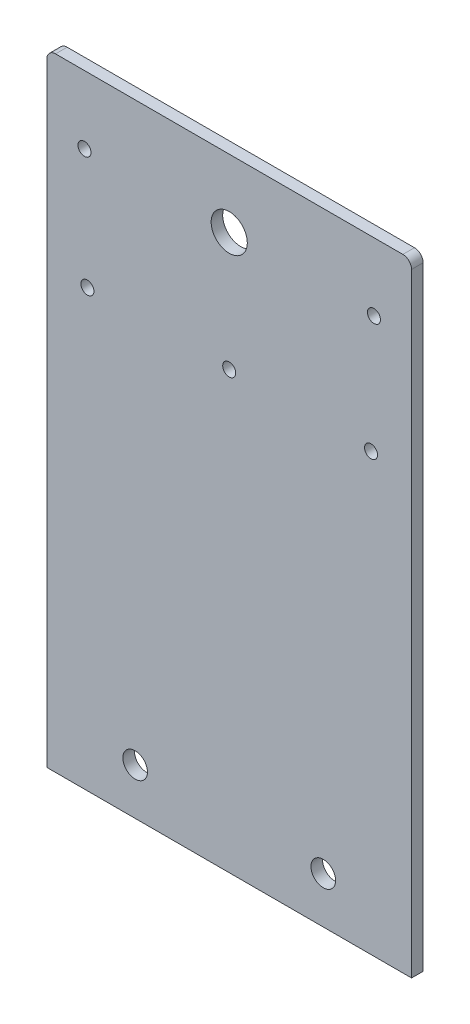
ISO-10303-21;
HEADER;
FILE_DESCRIPTION(('STEP AP214'),'2;1');
FILE_NAME('part.step','',(''),(''),'','','');
FILE_SCHEMA(('AUTOMOTIVE_DESIGN { 1 0 10303 214 1 1 1 1 }'));
ENDSEC;
DATA;
#1=APPLICATION_CONTEXT('core data for automotive mechanical design processes');
#2=APPLICATION_PROTOCOL_DEFINITION('international standard','automotive_design',2000,#1);
#3=PRODUCT_CONTEXT('',#1,'mechanical');
#4=PRODUCT('Part','Part','',(#3));
#5=PRODUCT_RELATED_PRODUCT_CATEGORY('part','',(#4));
#6=PRODUCT_DEFINITION_FORMATION('','',#4);
#7=PRODUCT_DEFINITION_CONTEXT('part definition',#1,'design');
#8=PRODUCT_DEFINITION('design','',#6,#7);
#9=PRODUCT_DEFINITION_SHAPE('','',#8);
#10=(LENGTH_UNIT() NAMED_UNIT(*) SI_UNIT(.MILLI.,.METRE.));
#11=(NAMED_UNIT(*) PLANE_ANGLE_UNIT() SI_UNIT($,.RADIAN.));
#12=(NAMED_UNIT(*) SI_UNIT($,.STERADIAN.) SOLID_ANGLE_UNIT());
#13=UNCERTAINTY_MEASURE_WITH_UNIT(LENGTH_MEASURE(1.E-05),#10,'distance_accuracy_value','');
#14=(GEOMETRIC_REPRESENTATION_CONTEXT(3) GLOBAL_UNCERTAINTY_ASSIGNED_CONTEXT((#13)) GLOBAL_UNIT_ASSIGNED_CONTEXT((#10,
#11,#12)) REPRESENTATION_CONTEXT('',''));
#15=CARTESIAN_POINT('',(0.,0.,0.));
#16=DIRECTION('',(0.,0.,1.));
#17=DIRECTION('',(1.,0.,0.));
#18=AXIS2_PLACEMENT_3D('',#15,#16,#17);
#19=CARTESIAN_POINT('',(2223.22133361921,1914.50039193908,-4.));
#20=DIRECTION('',(-1.,0.,0.));
#21=DIRECTION('',(0.,0.,1.));
#22=AXIS2_PLACEMENT_3D('',#19,#20,#21);
#23=PLANE('',#22);
#24=DIRECTION('',(0.,-1.,0.));
#25=VECTOR('',#24,1.);
#26=CARTESIAN_POINT('',(2223.22133361921,1914.50039193908,0.));
#27=LINE('',#26,#25);
#28=CARTESIAN_POINT('',(2223.22133361921,1911.50039193908,0.));
#29=VERTEX_POINT('',#28);
#30=CARTESIAN_POINT('',(2223.22133361921,1699.50039193908,0.));
#31=VERTEX_POINT('',#30);
#32=EDGE_CURVE('E117',#29,#31,#27,.T.);
#33=ORIENTED_EDGE('',*,*,#32,.F.);
#34=DIRECTION('',(0.,0.,1.));
#35=VECTOR('',#34,1.);
#36=CARTESIAN_POINT('',(2223.22133361921,1911.50039193908,-4.));
#37=LINE('',#36,#35);
#38=CARTESIAN_POINT('',(2223.22133361921,1911.50039193908,-4.));
#39=VERTEX_POINT('',#38);
#40=EDGE_CURVE('E11',#29,#39,#37,.F.);
#41=ORIENTED_EDGE('',*,*,#40,.T.);
#42=DIRECTION('',(0.,-1.,0.));
#43=VECTOR('',#42,1.);
#44=CARTESIAN_POINT('',(2223.22133361921,1914.50039193908,-4.));
#45=LINE('',#44,#43);
#46=CARTESIAN_POINT('',(2223.22133361921,1699.50039193908,-4.));
#47=VERTEX_POINT('',#46);
#48=EDGE_CURVE('E92',#39,#47,#45,.T.);
#49=ORIENTED_EDGE('',*,*,#48,.T.);
#50=DIRECTION('',(0.,0.,1.));
#51=VECTOR('',#50,1.);
#52=CARTESIAN_POINT('',(2223.22133361921,1699.50039193908,-4.));
#53=LINE('',#52,#51);
#54=EDGE_CURVE('E94',#47,#31,#53,.T.);
#55=ORIENTED_EDGE('',*,*,#54,.T.);
#56=EDGE_LOOP('',(#33,#41,#49,#55));
#57=FACE_BOUND('',#56,.T.);
#58=ADVANCED_FACE('F41',(#57),#23,.T.);
#59=CARTESIAN_POINT('',(2349.22133361921,1914.50039193908,-4.));
#60=DIRECTION('',(0.,1.,0.));
#61=DIRECTION('',(0.,0.,1.));
#62=AXIS2_PLACEMENT_3D('',#59,#60,#61);
#63=PLANE('',#62);
#64=DIRECTION('',(-1.,0.,0.));
#65=VECTOR('',#64,1.);
#66=CARTESIAN_POINT('',(2349.22133361921,1914.50039193908,0.));
#67=LINE('',#66,#65);
#68=CARTESIAN_POINT('',(2346.22133361921,1914.50039193908,0.));
#69=VERTEX_POINT('',#68);
#70=CARTESIAN_POINT('',(2226.22133361921,1914.50039193908,0.));
#71=VERTEX_POINT('',#70);
#72=EDGE_CURVE('E98',#69,#71,#67,.T.);
#73=ORIENTED_EDGE('',*,*,#72,.F.);
#74=DIRECTION('',(0.,0.,1.));
#75=VECTOR('',#74,1.);
#76=CARTESIAN_POINT('',(2346.22133361921,1914.50039193908,-4.));
#77=LINE('',#76,#75);
#78=CARTESIAN_POINT('',(2346.22133361921,1914.50039193908,-4.));
#79=VERTEX_POINT('',#78);
#80=EDGE_CURVE('E137',#69,#79,#77,.F.);
#81=ORIENTED_EDGE('',*,*,#80,.T.);
#82=DIRECTION('',(-1.,0.,0.));
#83=VECTOR('',#82,1.);
#84=CARTESIAN_POINT('',(2349.22133361921,1914.50039193908,-4.));
#85=LINE('',#84,#83);
#86=CARTESIAN_POINT('',(2226.22133361921,1914.50039193908,-4.));
#87=VERTEX_POINT('',#86);
#88=EDGE_CURVE('E106',#79,#87,#85,.T.);
#89=ORIENTED_EDGE('',*,*,#88,.T.);
#90=DIRECTION('',(0.,0.,1.));
#91=VECTOR('',#90,1.);
#92=CARTESIAN_POINT('',(2226.22133361921,1914.50039193908,-4.));
#93=LINE('',#92,#91);
#94=EDGE_CURVE('E134',#87,#71,#93,.T.);
#95=ORIENTED_EDGE('',*,*,#94,.T.);
#96=EDGE_LOOP('',(#73,#81,#89,#95));
#97=FACE_BOUND('',#96,.T.);
#98=ADVANCED_FACE('F151',(#97),#63,.T.);
#99=CARTESIAN_POINT('',(2349.22133361921,1699.50039193908,-4.));
#100=DIRECTION('',(1.,0.,0.));
#101=DIRECTION('',(0.,0.,-1.));
#102=AXIS2_PLACEMENT_3D('',#99,#100,#101);
#103=PLANE('',#102);
#104=DIRECTION('',(0.,1.,0.));
#105=VECTOR('',#104,1.);
#106=CARTESIAN_POINT('',(2349.22133361921,1699.50039193908,-4.));
#107=LINE('',#106,#105);
#108=CARTESIAN_POINT('',(2349.22133361921,1699.50039193908,-4.));
#109=VERTEX_POINT('',#108);
#110=CARTESIAN_POINT('',(2349.22133361921,1911.50039193908,-4.));
#111=VERTEX_POINT('',#110);
#112=EDGE_CURVE('E111',#109,#111,#107,.T.);
#113=ORIENTED_EDGE('',*,*,#112,.T.);
#114=DIRECTION('',(0.,0.,1.));
#115=VECTOR('',#114,1.);
#116=CARTESIAN_POINT('',(2349.22133361921,1911.50039193908,-4.));
#117=LINE('',#116,#115);
#118=CARTESIAN_POINT('',(2349.22133361921,1911.50039193908,0.));
#119=VERTEX_POINT('',#118);
#120=EDGE_CURVE('E126',#111,#119,#117,.T.);
#121=ORIENTED_EDGE('',*,*,#120,.T.);
#122=DIRECTION('',(0.,1.,0.));
#123=VECTOR('',#122,1.);
#124=CARTESIAN_POINT('',(2349.22133361921,1699.50039193908,0.));
#125=LINE('',#124,#123);
#126=CARTESIAN_POINT('',(2349.22133361921,1699.50039193908,0.));
#127=VERTEX_POINT('',#126);
#128=EDGE_CURVE('E121',#127,#119,#125,.T.);
#129=ORIENTED_EDGE('',*,*,#128,.F.);
#130=DIRECTION('',(0.,0.,1.));
#131=VECTOR('',#130,1.);
#132=CARTESIAN_POINT('',(2349.22133361921,1699.50039193908,-4.));
#133=LINE('',#132,#131);
#134=EDGE_CURVE('E105',#109,#127,#133,.T.);
#135=ORIENTED_EDGE('',*,*,#134,.F.);
#136=EDGE_LOOP('',(#113,#121,#129,#135));
#137=FACE_BOUND('',#136,.T.);
#138=ADVANCED_FACE('F144',(#137),#103,.T.);
#139=CARTESIAN_POINT('',(2223.22133361921,1699.50039193908,-4.));
#140=DIRECTION('',(0.,-1.,0.));
#141=DIRECTION('',(0.,0.,-1.));
#142=AXIS2_PLACEMENT_3D('',#139,#140,#141);
#143=PLANE('',#142);
#144=DIRECTION('',(1.,0.,0.));
#145=VECTOR('',#144,1.);
#146=CARTESIAN_POINT('',(2223.22133361921,1699.50039193908,0.));
#147=LINE('',#146,#145);
#148=EDGE_CURVE('E104',#31,#127,#147,.T.);
#149=ORIENTED_EDGE('',*,*,#148,.F.);
#150=ORIENTED_EDGE('',*,*,#54,.F.);
#151=DIRECTION('',(1.,0.,0.));
#152=VECTOR('',#151,1.);
#153=CARTESIAN_POINT('',(2223.22133361921,1699.50039193908,-4.));
#154=LINE('',#153,#152);
#155=EDGE_CURVE('E97',#47,#109,#154,.T.);
#156=ORIENTED_EDGE('',*,*,#155,.T.);
#157=ORIENTED_EDGE('',*,*,#134,.T.);
#158=EDGE_LOOP('',(#149,#150,#156,#157));
#159=FACE_BOUND('',#158,.T.);
#160=ADVANCED_FACE('F102',(#159),#143,.T.);
#161=CARTESIAN_POINT('',(0.,0.,-4.));
#162=DIRECTION('',(0.,0.,1.));
#163=DIRECTION('',(1.,0.,0.));
#164=AXIS2_PLACEMENT_3D('',#161,#162,#163);
#165=PLANE('',#164);
#166=CARTESIAN_POINT('',(2253.72133361921,1715.50039193908,-4.));
#167=DIRECTION('',(0.,0.,1.));
#168=DIRECTION('',(1.,0.,0.));
#169=AXIS2_PLACEMENT_3D('',#166,#167,#168);
#170=CIRCLE('',#169,4.24999999999981);
#171=CARTESIAN_POINT('',(2257.97133361921,1715.50039193908,-4.));
#172=VERTEX_POINT('',#171);
#173=EDGE_CURVE('E214',#172,#172,#170,.T.);
#174=ORIENTED_EDGE('',*,*,#173,.T.);
#175=EDGE_LOOP('',(#174));
#176=FACE_BOUND('',#175,.T.);
#177=CARTESIAN_POINT('',(2318.72133361921,1715.50039193908,-4.));
#178=DIRECTION('',(0.,0.,1.));
#179=DIRECTION('',(1.,0.,0.));
#180=AXIS2_PLACEMENT_3D('',#177,#178,#179);
#181=CIRCLE('',#180,4.24999999999981);
#182=CARTESIAN_POINT('',(2322.97133361921,1715.50039193908,-4.));
#183=VERTEX_POINT('',#182);
#184=EDGE_CURVE('E216',#183,#183,#181,.T.);
#185=ORIENTED_EDGE('',*,*,#184,.T.);
#186=EDGE_LOOP('',(#185));
#187=FACE_BOUND('',#186,.T.);
#188=CARTESIAN_POINT('',(2335.22132399011,1850.07710104147,-4.));
#189=DIRECTION('',(0.,0.,1.));
#190=DIRECTION('',(1.,0.,0.));
#191=AXIS2_PLACEMENT_3D('',#188,#189,#190);
#192=CIRCLE('',#191,2.25000000000009);
#193=CARTESIAN_POINT('',(2337.47132399011,1850.07710104147,-4.));
#194=VERTEX_POINT('',#193);
#195=EDGE_CURVE('E219',#194,#194,#192,.T.);
#196=ORIENTED_EDGE('',*,*,#195,.T.);
#197=EDGE_LOOP('',(#196));
#198=FACE_BOUND('',#197,.T.);
#199=CARTESIAN_POINT('',(2286.22133360148,1850.07709192478,-4.));
#200=DIRECTION('',(0.,0.,1.));
#201=DIRECTION('',(1.,0.,0.));
#202=AXIS2_PLACEMENT_3D('',#199,#200,#201);
#203=CIRCLE('',#202,2.25000000000009);
#204=CARTESIAN_POINT('',(2288.47133360148,1850.07709192478,-4.));
#205=VERTEX_POINT('',#204);
#206=EDGE_CURVE('E228',#205,#205,#203,.T.);
#207=ORIENTED_EDGE('',*,*,#206,.T.);
#208=EDGE_LOOP('',(#207));
#209=FACE_BOUND('',#208,.T.);
#210=CARTESIAN_POINT('',(2237.22133361921,1850.07709193908,-4.));
#211=DIRECTION('',(0.,0.,1.));
#212=DIRECTION('',(1.,0.,0.));
#213=AXIS2_PLACEMENT_3D('',#210,#211,#212);
#214=CIRCLE('',#213,2.25000000000009);
#215=CARTESIAN_POINT('',(2239.47133361921,1850.07709193908,-4.));
#216=VERTEX_POINT('',#215);
#217=EDGE_CURVE('E234',#216,#216,#214,.T.);
#218=ORIENTED_EDGE('',*,*,#217,.T.);
#219=EDGE_LOOP('',(#218));
#220=FACE_BOUND('',#219,.T.);
#221=CARTESIAN_POINT('',(2336.22131775677,1891.0768015385,-4.));
#222=DIRECTION('',(0.,0.,1.));
#223=DIRECTION('',(1.,0.,0.));
#224=AXIS2_PLACEMENT_3D('',#221,#222,#223);
#225=CIRCLE('',#224,2.25000000000009);
#226=CARTESIAN_POINT('',(2338.47131775677,1891.0768015385,-4.));
#227=VERTEX_POINT('',#226);
#228=EDGE_CURVE('E240',#227,#227,#225,.T.);
#229=ORIENTED_EDGE('',*,*,#228,.T.);
#230=EDGE_LOOP('',(#229));
#231=FACE_BOUND('',#230,.T.);
#232=CARTESIAN_POINT('',(2236.22131775677,1891.0768015385,-4.));
#233=DIRECTION('',(0.,0.,1.));
#234=DIRECTION('',(1.,0.,0.));
#235=AXIS2_PLACEMENT_3D('',#232,#233,#234);
#236=CIRCLE('',#235,2.25000000000009);
#237=CARTESIAN_POINT('',(2238.47131775677,1891.0768015385,-4.));
#238=VERTEX_POINT('',#237);
#239=EDGE_CURVE('E246',#238,#238,#236,.T.);
#240=ORIENTED_EDGE('',*,*,#239,.T.);
#241=EDGE_LOOP('',(#240));
#242=FACE_BOUND('',#241,.T.);
#243=CARTESIAN_POINT('',(2286.22132902405,1891.07679671491,-4.));
#244=DIRECTION('',(0.,0.,1.));
#245=DIRECTION('',(1.,0.,0.));
#246=AXIS2_PLACEMENT_3D('',#243,#244,#245);
#247=CIRCLE('',#246,6.25000000000009);
#248=CARTESIAN_POINT('',(2292.47132902405,1891.07679671491,-4.));
#249=VERTEX_POINT('',#248);
#250=EDGE_CURVE('E119',#249,#249,#247,.T.);
#251=ORIENTED_EDGE('',*,*,#250,.T.);
#252=EDGE_LOOP('',(#251));
#253=FACE_BOUND('',#252,.T.);
#254=ORIENTED_EDGE('',*,*,#88,.F.);
#255=CARTESIAN_POINT('',(2346.22133361921,1911.50039193908,-4.));
#256=DIRECTION('',(0.,0.,1.));
#257=DIRECTION('',(1.,0.,0.));
#258=AXIS2_PLACEMENT_3D('',#255,#256,#257);
#259=CIRCLE('',#258,3.);
#260=EDGE_CURVE('E49',#79,#111,#259,.F.);
#261=ORIENTED_EDGE('',*,*,#260,.T.);
#262=ORIENTED_EDGE('',*,*,#112,.F.);
#263=ORIENTED_EDGE('',*,*,#155,.F.);
#264=ORIENTED_EDGE('',*,*,#48,.F.);
#265=CARTESIAN_POINT('',(2226.22133361921,1911.50039193908,-4.));
#266=DIRECTION('',(0.,0.,1.));
#267=DIRECTION('',(1.,0.,0.));
#268=AXIS2_PLACEMENT_3D('',#265,#266,#267);
#269=CIRCLE('',#268,3.);
#270=EDGE_CURVE('E61',#39,#87,#269,.F.);
#271=ORIENTED_EDGE('',*,*,#270,.T.);
#272=EDGE_LOOP('',(#254,#261,#262,#263,#264,#271));
#273=FACE_BOUND('',#272,.T.);
#274=ADVANCED_FACE('F109',(#176,#187,#198,#209,#220,#231,#242,#253,#273),#165,.F.);
#275=CARTESIAN_POINT('',(0.,0.,0.));
#276=DIRECTION('',(0.,0.,1.));
#277=DIRECTION('',(1.,0.,0.));
#278=AXIS2_PLACEMENT_3D('',#275,#276,#277);
#279=PLANE('',#278);
#280=CARTESIAN_POINT('',(2253.72133361921,1715.50039193908,0.));
#281=DIRECTION('',(0.,0.,1.));
#282=DIRECTION('',(1.,0.,0.));
#283=AXIS2_PLACEMENT_3D('',#280,#281,#282);
#284=CIRCLE('',#283,4.24999999999981);
#285=CARTESIAN_POINT('',(2257.97133361921,1715.50039193908,0.));
#286=VERTEX_POINT('',#285);
#287=EDGE_CURVE('E211',#286,#286,#284,.T.);
#288=ORIENTED_EDGE('',*,*,#287,.F.);
#289=EDGE_LOOP('',(#288));
#290=FACE_BOUND('',#289,.T.);
#291=CARTESIAN_POINT('',(2318.72133361921,1715.50039193908,0.));
#292=DIRECTION('',(0.,0.,1.));
#293=DIRECTION('',(1.,0.,0.));
#294=AXIS2_PLACEMENT_3D('',#291,#292,#293);
#295=CIRCLE('',#294,4.24999999999981);
#296=CARTESIAN_POINT('',(2322.97133361921,1715.50039193908,0.));
#297=VERTEX_POINT('',#296);
#298=EDGE_CURVE('E284',#297,#297,#295,.T.);
#299=ORIENTED_EDGE('',*,*,#298,.F.);
#300=EDGE_LOOP('',(#299));
#301=FACE_BOUND('',#300,.T.);
#302=CARTESIAN_POINT('',(2335.22132399011,1850.07710104147,0.));
#303=DIRECTION('',(0.,0.,1.));
#304=DIRECTION('',(1.,0.,0.));
#305=AXIS2_PLACEMENT_3D('',#302,#303,#304);
#306=CIRCLE('',#305,2.25000000000009);
#307=CARTESIAN_POINT('',(2337.47132399011,1850.07710104147,0.));
#308=VERTEX_POINT('',#307);
#309=EDGE_CURVE('E215',#308,#308,#306,.T.);
#310=ORIENTED_EDGE('',*,*,#309,.F.);
#311=EDGE_LOOP('',(#310));
#312=FACE_BOUND('',#311,.T.);
#313=CARTESIAN_POINT('',(2286.22133360148,1850.07709192478,0.));
#314=DIRECTION('',(0.,0.,1.));
#315=DIRECTION('',(1.,0.,0.));
#316=AXIS2_PLACEMENT_3D('',#313,#314,#315);
#317=CIRCLE('',#316,2.25000000000009);
#318=CARTESIAN_POINT('',(2288.47133360148,1850.07709192478,0.));
#319=VERTEX_POINT('',#318);
#320=EDGE_CURVE('E226',#319,#319,#317,.T.);
#321=ORIENTED_EDGE('',*,*,#320,.F.);
#322=EDGE_LOOP('',(#321));
#323=FACE_BOUND('',#322,.T.);
#324=CARTESIAN_POINT('',(2237.22133361921,1850.07709193908,0.));
#325=DIRECTION('',(0.,0.,1.));
#326=DIRECTION('',(1.,0.,0.));
#327=AXIS2_PLACEMENT_3D('',#324,#325,#326);
#328=CIRCLE('',#327,2.25000000000009);
#329=CARTESIAN_POINT('',(2239.47133361921,1850.07709193908,0.));
#330=VERTEX_POINT('',#329);
#331=EDGE_CURVE('E231',#330,#330,#328,.T.);
#332=ORIENTED_EDGE('',*,*,#331,.F.);
#333=EDGE_LOOP('',(#332));
#334=FACE_BOUND('',#333,.T.);
#335=CARTESIAN_POINT('',(2336.22131775677,1891.0768015385,0.));
#336=DIRECTION('',(0.,0.,1.));
#337=DIRECTION('',(1.,0.,0.));
#338=AXIS2_PLACEMENT_3D('',#335,#336,#337);
#339=CIRCLE('',#338,2.25000000000009);
#340=CARTESIAN_POINT('',(2338.47131775677,1891.0768015385,0.));
#341=VERTEX_POINT('',#340);
#342=EDGE_CURVE('E237',#341,#341,#339,.T.);
#343=ORIENTED_EDGE('',*,*,#342,.F.);
#344=EDGE_LOOP('',(#343));
#345=FACE_BOUND('',#344,.T.);
#346=CARTESIAN_POINT('',(2236.22131775677,1891.0768015385,0.));
#347=DIRECTION('',(0.,0.,1.));
#348=DIRECTION('',(1.,0.,0.));
#349=AXIS2_PLACEMENT_3D('',#346,#347,#348);
#350=CIRCLE('',#349,2.25000000000009);
#351=CARTESIAN_POINT('',(2238.47131775677,1891.0768015385,0.));
#352=VERTEX_POINT('',#351);
#353=EDGE_CURVE('E243',#352,#352,#350,.T.);
#354=ORIENTED_EDGE('',*,*,#353,.F.);
#355=EDGE_LOOP('',(#354));
#356=FACE_BOUND('',#355,.T.);
#357=CARTESIAN_POINT('',(2286.22132902405,1891.07679671491,0.));
#358=DIRECTION('',(0.,0.,1.));
#359=DIRECTION('',(1.,0.,0.));
#360=AXIS2_PLACEMENT_3D('',#357,#358,#359);
#361=CIRCLE('',#360,6.25000000000009);
#362=CARTESIAN_POINT('',(2292.47132902405,1891.07679671491,0.));
#363=VERTEX_POINT('',#362);
#364=EDGE_CURVE('E249',#363,#363,#361,.T.);
#365=ORIENTED_EDGE('',*,*,#364,.F.);
#366=EDGE_LOOP('',(#365));
#367=FACE_BOUND('',#366,.T.);
#368=ORIENTED_EDGE('',*,*,#128,.T.);
#369=CARTESIAN_POINT('',(2346.22133361921,1911.50039193908,0.));
#370=DIRECTION('',(0.,0.,1.));
#371=DIRECTION('',(1.,0.,0.));
#372=AXIS2_PLACEMENT_3D('',#369,#370,#371);
#373=CIRCLE('',#372,3.);
#374=EDGE_CURVE('E132',#119,#69,#373,.T.);
#375=ORIENTED_EDGE('',*,*,#374,.T.);
#376=ORIENTED_EDGE('',*,*,#72,.T.);
#377=CARTESIAN_POINT('',(2226.22133361921,1911.50039193908,0.));
#378=DIRECTION('',(0.,0.,1.));
#379=DIRECTION('',(1.,0.,0.));
#380=AXIS2_PLACEMENT_3D('',#377,#378,#379);
#381=CIRCLE('',#380,3.);
#382=EDGE_CURVE('E130',#71,#29,#381,.T.);
#383=ORIENTED_EDGE('',*,*,#382,.T.);
#384=ORIENTED_EDGE('',*,*,#32,.T.);
#385=ORIENTED_EDGE('',*,*,#148,.T.);
#386=EDGE_LOOP('',(#368,#375,#376,#383,#384,#385));
#387=FACE_BOUND('',#386,.T.);
#388=ADVANCED_FACE('F149',(#290,#301,#312,#323,#334,#345,#356,#367,#387),#279,.T.);
#389=CARTESIAN_POINT('',(2286.22132902405,1891.07679671491,-4.));
#390=DIRECTION('',(0.,0.,1.));
#391=DIRECTION('',(1.,0.,0.));
#392=AXIS2_PLACEMENT_3D('',#389,#390,#391);
#393=CYLINDRICAL_SURFACE('',#392,6.25000000000009);
#394=ORIENTED_EDGE('',*,*,#250,.F.);
#395=EDGE_LOOP('',(#394));
#396=FACE_BOUND('',#395,.T.);
#397=ORIENTED_EDGE('',*,*,#364,.T.);
#398=EDGE_LOOP('',(#397));
#399=FACE_BOUND('',#398,.T.);
#400=ADVANCED_FACE('F172',(#396,#399),#393,.F.);
#401=CARTESIAN_POINT('',(2236.22131775677,1891.0768015385,-4.));
#402=DIRECTION('',(0.,0.,1.));
#403=DIRECTION('',(1.,0.,0.));
#404=AXIS2_PLACEMENT_3D('',#401,#402,#403);
#405=CYLINDRICAL_SURFACE('',#404,2.25000000000009);
#406=ORIENTED_EDGE('',*,*,#239,.F.);
#407=EDGE_LOOP('',(#406));
#408=FACE_BOUND('',#407,.T.);
#409=ORIENTED_EDGE('',*,*,#353,.T.);
#410=EDGE_LOOP('',(#409));
#411=FACE_BOUND('',#410,.T.);
#412=ADVANCED_FACE('F179',(#408,#411),#405,.F.);
#413=CARTESIAN_POINT('',(2336.22131775677,1891.0768015385,-4.));
#414=DIRECTION('',(0.,0.,1.));
#415=DIRECTION('',(1.,0.,0.));
#416=AXIS2_PLACEMENT_3D('',#413,#414,#415);
#417=CYLINDRICAL_SURFACE('',#416,2.25000000000009);
#418=ORIENTED_EDGE('',*,*,#228,.F.);
#419=EDGE_LOOP('',(#418));
#420=FACE_BOUND('',#419,.T.);
#421=ORIENTED_EDGE('',*,*,#342,.T.);
#422=EDGE_LOOP('',(#421));
#423=FACE_BOUND('',#422,.T.);
#424=ADVANCED_FACE('F183',(#420,#423),#417,.F.);
#425=CARTESIAN_POINT('',(2237.22133361921,1850.07709193908,-4.));
#426=DIRECTION('',(0.,0.,1.));
#427=DIRECTION('',(1.,0.,0.));
#428=AXIS2_PLACEMENT_3D('',#425,#426,#427);
#429=CYLINDRICAL_SURFACE('',#428,2.25000000000009);
#430=ORIENTED_EDGE('',*,*,#217,.F.);
#431=EDGE_LOOP('',(#430));
#432=FACE_BOUND('',#431,.T.);
#433=ORIENTED_EDGE('',*,*,#331,.T.);
#434=EDGE_LOOP('',(#433));
#435=FACE_BOUND('',#434,.T.);
#436=ADVANCED_FACE('F187',(#432,#435),#429,.F.);
#437=CARTESIAN_POINT('',(2286.22133360148,1850.07709192478,-4.));
#438=DIRECTION('',(0.,0.,1.));
#439=DIRECTION('',(1.,0.,0.));
#440=AXIS2_PLACEMENT_3D('',#437,#438,#439);
#441=CYLINDRICAL_SURFACE('',#440,2.25000000000009);
#442=ORIENTED_EDGE('',*,*,#206,.F.);
#443=EDGE_LOOP('',(#442));
#444=FACE_BOUND('',#443,.T.);
#445=ORIENTED_EDGE('',*,*,#320,.T.);
#446=EDGE_LOOP('',(#445));
#447=FACE_BOUND('',#446,.T.);
#448=ADVANCED_FACE('F191',(#444,#447),#441,.F.);
#449=CARTESIAN_POINT('',(2335.22132399011,1850.07710104147,-4.));
#450=DIRECTION('',(0.,0.,1.));
#451=DIRECTION('',(1.,0.,0.));
#452=AXIS2_PLACEMENT_3D('',#449,#450,#451);
#453=CYLINDRICAL_SURFACE('',#452,2.25000000000009);
#454=ORIENTED_EDGE('',*,*,#195,.F.);
#455=EDGE_LOOP('',(#454));
#456=FACE_BOUND('',#455,.T.);
#457=ORIENTED_EDGE('',*,*,#309,.T.);
#458=EDGE_LOOP('',(#457));
#459=FACE_BOUND('',#458,.T.);
#460=ADVANCED_FACE('F195',(#456,#459),#453,.F.);
#461=CARTESIAN_POINT('',(2318.72133361921,1715.50039193908,-10.));
#462=DIRECTION('',(0.,0.,1.));
#463=DIRECTION('',(1.,0.,0.));
#464=AXIS2_PLACEMENT_3D('',#461,#462,#463);
#465=CYLINDRICAL_SURFACE('',#464,4.24999999999981);
#466=ORIENTED_EDGE('',*,*,#298,.T.);
#467=EDGE_LOOP('',(#466));
#468=FACE_BOUND('',#467,.T.);
#469=ORIENTED_EDGE('',*,*,#184,.F.);
#470=EDGE_LOOP('',(#469));
#471=FACE_BOUND('',#470,.T.);
#472=ADVANCED_FACE('F199',(#468,#471),#465,.F.);
#473=CARTESIAN_POINT('',(2253.72133361921,1715.50039193908,-10.));
#474=DIRECTION('',(0.,0.,1.));
#475=DIRECTION('',(1.,0.,0.));
#476=AXIS2_PLACEMENT_3D('',#473,#474,#475);
#477=CYLINDRICAL_SURFACE('',#476,4.24999999999981);
#478=ORIENTED_EDGE('',*,*,#287,.T.);
#479=EDGE_LOOP('',(#478));
#480=FACE_BOUND('',#479,.T.);
#481=ORIENTED_EDGE('',*,*,#173,.F.);
#482=EDGE_LOOP('',(#481));
#483=FACE_BOUND('',#482,.T.);
#484=ADVANCED_FACE('F158',(#480,#483),#477,.F.);
#485=CARTESIAN_POINT('',(2346.22133361921,1911.50039193908,-4.));
#486=DIRECTION('',(0.,0.,1.));
#487=DIRECTION('',(1.,0.,0.));
#488=AXIS2_PLACEMENT_3D('',#485,#486,#487);
#489=CYLINDRICAL_SURFACE('',#488,3.);
#490=ORIENTED_EDGE('',*,*,#260,.F.);
#491=ORIENTED_EDGE('',*,*,#80,.F.);
#492=ORIENTED_EDGE('',*,*,#374,.F.);
#493=ORIENTED_EDGE('',*,*,#120,.F.);
#494=EDGE_LOOP('',(#490,#491,#492,#493));
#495=FACE_BOUND('',#494,.T.);
#496=ADVANCED_FACE('F146',(#495),#489,.T.);
#497=CARTESIAN_POINT('',(2226.22133361921,1911.50039193908,-4.));
#498=DIRECTION('',(0.,0.,1.));
#499=DIRECTION('',(1.,0.,0.));
#500=AXIS2_PLACEMENT_3D('',#497,#498,#499);
#501=CYLINDRICAL_SURFACE('',#500,3.);
#502=ORIENTED_EDGE('',*,*,#270,.F.);
#503=ORIENTED_EDGE('',*,*,#40,.F.);
#504=ORIENTED_EDGE('',*,*,#382,.F.);
#505=ORIENTED_EDGE('',*,*,#94,.F.);
#506=EDGE_LOOP('',(#502,#503,#504,#505));
#507=FACE_BOUND('',#506,.T.);
#508=ADVANCED_FACE('F43',(#507),#501,.T.);
#509=CLOSED_SHELL('',(#58,#98,#138,#160,#274,#388,#400,#412,#424,#436,#448,#460,#472,#484,#496,#508));
#510=MANIFOLD_SOLID_BREP('B2',#509);
#511=ADVANCED_BREP_SHAPE_REPRESENTATION('',(#18,#510),#14);
#512=SHAPE_DEFINITION_REPRESENTATION(#9,#511);
ENDSEC;
END-ISO-10303-21;
